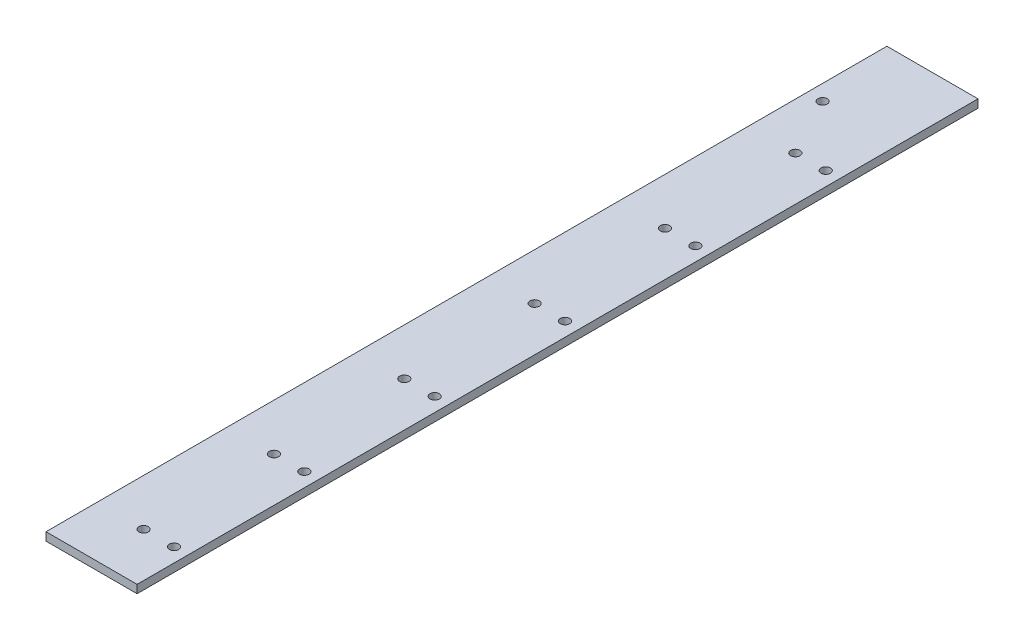
ISO-10303-21;
HEADER;
FILE_DESCRIPTION(('STEP AP214'),'2;1');
FILE_NAME('part.step','',(''),(''),'','','');
FILE_SCHEMA(('AUTOMOTIVE_DESIGN { 1 0 10303 214 1 1 1 1 }'));
ENDSEC;
DATA;
#1=APPLICATION_CONTEXT('core data for automotive mechanical design processes');
#2=APPLICATION_PROTOCOL_DEFINITION('international standard','automotive_design',2000,#1);
#3=PRODUCT_CONTEXT('',#1,'mechanical');
#4=PRODUCT('Part','Part','',(#3));
#5=PRODUCT_RELATED_PRODUCT_CATEGORY('part','',(#4));
#6=PRODUCT_DEFINITION_FORMATION('','',#4);
#7=PRODUCT_DEFINITION_CONTEXT('part definition',#1,'design');
#8=PRODUCT_DEFINITION('design','',#6,#7);
#9=PRODUCT_DEFINITION_SHAPE('','',#8);
#10=(LENGTH_UNIT() NAMED_UNIT(*) SI_UNIT(.MILLI.,.METRE.));
#11=(NAMED_UNIT(*) PLANE_ANGLE_UNIT() SI_UNIT($,.RADIAN.));
#12=(NAMED_UNIT(*) SI_UNIT($,.STERADIAN.) SOLID_ANGLE_UNIT());
#13=UNCERTAINTY_MEASURE_WITH_UNIT(LENGTH_MEASURE(1.E-05),#10,'distance_accuracy_value','');
#14=(GEOMETRIC_REPRESENTATION_CONTEXT(3) GLOBAL_UNCERTAINTY_ASSIGNED_CONTEXT((#13)) GLOBAL_UNIT_ASSIGNED_CONTEXT((#10,
#11,#12)) REPRESENTATION_CONTEXT('',''));
#15=CARTESIAN_POINT('',(0.,0.,0.));
#16=DIRECTION('',(0.,0.,1.));
#17=DIRECTION('',(1.,0.,0.));
#18=AXIS2_PLACEMENT_3D('',#15,#16,#17);
#19=CARTESIAN_POINT('',(13.5,-8.25,338.2));
#20=DIRECTION('',(0.,1.,0.));
#21=DIRECTION('',(0.,0.,1.));
#22=AXIS2_PLACEMENT_3D('',#19,#20,#21);
#23=CYLINDRICAL_SURFACE('',#22,2.);
#24=CARTESIAN_POINT('',(13.5,1.75,338.2));
#25=DIRECTION('',(0.,1.,0.));
#26=DIRECTION('',(0.,0.,1.));
#27=AXIS2_PLACEMENT_3D('',#24,#25,#26);
#28=CIRCLE('',#27,2.);
#29=CARTESIAN_POINT('',(13.5,1.75,340.2));
#30=VERTEX_POINT('',#29);
#31=EDGE_CURVE('E47',#30,#30,#28,.T.);
#32=ORIENTED_EDGE('',*,*,#31,.T.);
#33=EDGE_LOOP('',(#32));
#34=FACE_BOUND('',#33,.T.);
#35=CARTESIAN_POINT('',(13.5,-1.75,338.2));
#36=DIRECTION('',(0.,1.,0.));
#37=DIRECTION('',(0.,0.,1.));
#38=AXIS2_PLACEMENT_3D('',#35,#36,#37);
#39=CIRCLE('',#38,2.);
#40=CARTESIAN_POINT('',(13.5,-1.75,340.2));
#41=VERTEX_POINT('',#40);
#42=EDGE_CURVE('E11',#41,#41,#39,.T.);
#43=ORIENTED_EDGE('',*,*,#42,.F.);
#44=EDGE_LOOP('',(#43));
#45=FACE_BOUND('',#44,.T.);
#46=ADVANCED_FACE('F39',(#34,#45),#23,.F.);
#47=CARTESIAN_POINT('',(13.5,-8.25,282.4));
#48=DIRECTION('',(0.,1.,0.));
#49=DIRECTION('',(0.,0.,1.));
#50=AXIS2_PLACEMENT_3D('',#47,#48,#49);
#51=CYLINDRICAL_SURFACE('',#50,2.);
#52=CARTESIAN_POINT('',(13.5,1.75,282.4));
#53=DIRECTION('',(0.,1.,0.));
#54=DIRECTION('',(0.,0.,1.));
#55=AXIS2_PLACEMENT_3D('',#52,#53,#54);
#56=CIRCLE('',#55,2.);
#57=CARTESIAN_POINT('',(13.5,1.75,284.4));
#58=VERTEX_POINT('',#57);
#59=EDGE_CURVE('E156',#58,#58,#56,.T.);
#60=ORIENTED_EDGE('',*,*,#59,.T.);
#61=EDGE_LOOP('',(#60));
#62=FACE_BOUND('',#61,.T.);
#63=CARTESIAN_POINT('',(13.5,-1.75,282.4));
#64=DIRECTION('',(0.,1.,0.));
#65=DIRECTION('',(0.,0.,1.));
#66=AXIS2_PLACEMENT_3D('',#63,#64,#65);
#67=CIRCLE('',#66,2.);
#68=CARTESIAN_POINT('',(13.5,-1.75,284.4));
#69=VERTEX_POINT('',#68);
#70=EDGE_CURVE('E159',#69,#69,#67,.T.);
#71=ORIENTED_EDGE('',*,*,#70,.F.);
#72=EDGE_LOOP('',(#71));
#73=FACE_BOUND('',#72,.T.);
#74=ADVANCED_FACE('F181',(#62,#73),#51,.F.);
#75=CARTESIAN_POINT('',(13.5,-8.25,226.6));
#76=DIRECTION('',(0.,1.,0.));
#77=DIRECTION('',(0.,0.,1.));
#78=AXIS2_PLACEMENT_3D('',#75,#76,#77);
#79=CYLINDRICAL_SURFACE('',#78,2.);
#80=CARTESIAN_POINT('',(13.5,1.75,226.6));
#81=DIRECTION('',(0.,1.,0.));
#82=DIRECTION('',(0.,0.,1.));
#83=AXIS2_PLACEMENT_3D('',#80,#81,#82);
#84=CIRCLE('',#83,2.);
#85=CARTESIAN_POINT('',(13.5,1.75,228.6));
#86=VERTEX_POINT('',#85);
#87=EDGE_CURVE('E150',#86,#86,#84,.T.);
#88=ORIENTED_EDGE('',*,*,#87,.T.);
#89=EDGE_LOOP('',(#88));
#90=FACE_BOUND('',#89,.T.);
#91=CARTESIAN_POINT('',(13.5,-1.75,226.6));
#92=DIRECTION('',(0.,1.,0.));
#93=DIRECTION('',(0.,0.,1.));
#94=AXIS2_PLACEMENT_3D('',#91,#92,#93);
#95=CIRCLE('',#94,2.);
#96=CARTESIAN_POINT('',(13.5,-1.75,228.6));
#97=VERTEX_POINT('',#96);
#98=EDGE_CURVE('E153',#97,#97,#95,.T.);
#99=ORIENTED_EDGE('',*,*,#98,.F.);
#100=EDGE_LOOP('',(#99));
#101=FACE_BOUND('',#100,.T.);
#102=ADVANCED_FACE('F185',(#90,#101),#79,.F.);
#103=CARTESIAN_POINT('',(13.5,-8.25,170.8));
#104=DIRECTION('',(0.,1.,0.));
#105=DIRECTION('',(0.,0.,1.));
#106=AXIS2_PLACEMENT_3D('',#103,#104,#105);
#107=CYLINDRICAL_SURFACE('',#106,2.);
#108=CARTESIAN_POINT('',(13.5,1.75,170.8));
#109=DIRECTION('',(0.,1.,0.));
#110=DIRECTION('',(0.,0.,1.));
#111=AXIS2_PLACEMENT_3D('',#108,#109,#110);
#112=CIRCLE('',#111,2.);
#113=CARTESIAN_POINT('',(13.5,1.75,172.8));
#114=VERTEX_POINT('',#113);
#115=EDGE_CURVE('E144',#114,#114,#112,.T.);
#116=ORIENTED_EDGE('',*,*,#115,.T.);
#117=EDGE_LOOP('',(#116));
#118=FACE_BOUND('',#117,.T.);
#119=CARTESIAN_POINT('',(13.5,-1.75,170.8));
#120=DIRECTION('',(0.,1.,0.));
#121=DIRECTION('',(0.,0.,1.));
#122=AXIS2_PLACEMENT_3D('',#119,#120,#121);
#123=CIRCLE('',#122,2.);
#124=CARTESIAN_POINT('',(13.5,-1.75,172.8));
#125=VERTEX_POINT('',#124);
#126=EDGE_CURVE('E147',#125,#125,#123,.T.);
#127=ORIENTED_EDGE('',*,*,#126,.F.);
#128=EDGE_LOOP('',(#127));
#129=FACE_BOUND('',#128,.T.);
#130=ADVANCED_FACE('F190',(#118,#129),#107,.F.);
#131=CARTESIAN_POINT('',(0.499999999999994,-8.25,338.2));
#132=DIRECTION('',(0.,1.,0.));
#133=DIRECTION('',(0.,0.,1.));
#134=AXIS2_PLACEMENT_3D('',#131,#132,#133);
#135=CYLINDRICAL_SURFACE('',#134,2.);
#136=CARTESIAN_POINT('',(0.499999999999994,1.75,338.2));
#137=DIRECTION('',(0.,1.,0.));
#138=DIRECTION('',(0.,0.,1.));
#139=AXIS2_PLACEMENT_3D('',#136,#137,#138);
#140=CIRCLE('',#139,2.);
#141=CARTESIAN_POINT('',(0.499999999999994,1.75,340.2));
#142=VERTEX_POINT('',#141);
#143=EDGE_CURVE('E138',#142,#142,#140,.T.);
#144=ORIENTED_EDGE('',*,*,#143,.T.);
#145=EDGE_LOOP('',(#144));
#146=FACE_BOUND('',#145,.T.);
#147=CARTESIAN_POINT('',(0.499999999999994,-1.75,338.2));
#148=DIRECTION('',(0.,1.,0.));
#149=DIRECTION('',(0.,0.,1.));
#150=AXIS2_PLACEMENT_3D('',#147,#148,#149);
#151=CIRCLE('',#150,2.);
#152=CARTESIAN_POINT('',(0.499999999999994,-1.75,340.2));
#153=VERTEX_POINT('',#152);
#154=EDGE_CURVE('E141',#153,#153,#151,.T.);
#155=ORIENTED_EDGE('',*,*,#154,.F.);
#156=EDGE_LOOP('',(#155));
#157=FACE_BOUND('',#156,.T.);
#158=ADVANCED_FACE('F197',(#146,#157),#135,.F.);
#159=CARTESIAN_POINT('',(0.499999999999994,-8.25,282.4));
#160=DIRECTION('',(0.,1.,0.));
#161=DIRECTION('',(0.,0.,1.));
#162=AXIS2_PLACEMENT_3D('',#159,#160,#161);
#163=CYLINDRICAL_SURFACE('',#162,2.);
#164=CARTESIAN_POINT('',(0.499999999999994,1.75,282.4));
#165=DIRECTION('',(0.,1.,0.));
#166=DIRECTION('',(0.,0.,1.));
#167=AXIS2_PLACEMENT_3D('',#164,#165,#166);
#168=CIRCLE('',#167,2.);
#169=CARTESIAN_POINT('',(0.499999999999994,1.75,284.4));
#170=VERTEX_POINT('',#169);
#171=EDGE_CURVE('E132',#170,#170,#168,.T.);
#172=ORIENTED_EDGE('',*,*,#171,.T.);
#173=EDGE_LOOP('',(#172));
#174=FACE_BOUND('',#173,.T.);
#175=CARTESIAN_POINT('',(0.499999999999994,-1.75,282.4));
#176=DIRECTION('',(0.,1.,0.));
#177=DIRECTION('',(0.,0.,1.));
#178=AXIS2_PLACEMENT_3D('',#175,#176,#177);
#179=CIRCLE('',#178,2.);
#180=CARTESIAN_POINT('',(0.499999999999994,-1.75,284.4));
#181=VERTEX_POINT('',#180);
#182=EDGE_CURVE('E135',#181,#181,#179,.T.);
#183=ORIENTED_EDGE('',*,*,#182,.F.);
#184=EDGE_LOOP('',(#183));
#185=FACE_BOUND('',#184,.T.);
#186=ADVANCED_FACE('F201',(#174,#185),#163,.F.);
#187=CARTESIAN_POINT('',(0.499999999999994,-8.25,226.6));
#188=DIRECTION('',(0.,1.,0.));
#189=DIRECTION('',(0.,0.,1.));
#190=AXIS2_PLACEMENT_3D('',#187,#188,#189);
#191=CYLINDRICAL_SURFACE('',#190,2.);
#192=CARTESIAN_POINT('',(0.499999999999994,1.75,226.6));
#193=DIRECTION('',(0.,1.,0.));
#194=DIRECTION('',(0.,0.,1.));
#195=AXIS2_PLACEMENT_3D('',#192,#193,#194);
#196=CIRCLE('',#195,2.);
#197=CARTESIAN_POINT('',(0.499999999999994,1.75,228.6));
#198=VERTEX_POINT('',#197);
#199=EDGE_CURVE('E126',#198,#198,#196,.T.);
#200=ORIENTED_EDGE('',*,*,#199,.T.);
#201=EDGE_LOOP('',(#200));
#202=FACE_BOUND('',#201,.T.);
#203=CARTESIAN_POINT('',(0.499999999999994,-1.75,226.6));
#204=DIRECTION('',(0.,1.,0.));
#205=DIRECTION('',(0.,0.,1.));
#206=AXIS2_PLACEMENT_3D('',#203,#204,#205);
#207=CIRCLE('',#206,2.);
#208=CARTESIAN_POINT('',(0.499999999999994,-1.75,228.6));
#209=VERTEX_POINT('',#208);
#210=EDGE_CURVE('E129',#209,#209,#207,.T.);
#211=ORIENTED_EDGE('',*,*,#210,.F.);
#212=EDGE_LOOP('',(#211));
#213=FACE_BOUND('',#212,.T.);
#214=ADVANCED_FACE('F205',(#202,#213),#191,.F.);
#215=CARTESIAN_POINT('',(0.499999999999994,-8.25,170.8));
#216=DIRECTION('',(0.,1.,0.));
#217=DIRECTION('',(0.,0.,1.));
#218=AXIS2_PLACEMENT_3D('',#215,#216,#217);
#219=CYLINDRICAL_SURFACE('',#218,2.);
#220=CARTESIAN_POINT('',(0.499999999999994,1.75,170.8));
#221=DIRECTION('',(0.,1.,0.));
#222=DIRECTION('',(0.,0.,1.));
#223=AXIS2_PLACEMENT_3D('',#220,#221,#222);
#224=CIRCLE('',#223,2.);
#225=CARTESIAN_POINT('',(0.499999999999994,1.75,172.8));
#226=VERTEX_POINT('',#225);
#227=EDGE_CURVE('E118',#226,#226,#224,.T.);
#228=ORIENTED_EDGE('',*,*,#227,.T.);
#229=EDGE_LOOP('',(#228));
#230=FACE_BOUND('',#229,.T.);
#231=CARTESIAN_POINT('',(0.499999999999994,-1.75,170.8));
#232=DIRECTION('',(0.,1.,0.));
#233=DIRECTION('',(0.,0.,1.));
#234=AXIS2_PLACEMENT_3D('',#231,#232,#233);
#235=CIRCLE('',#234,2.);
#236=CARTESIAN_POINT('',(0.499999999999994,-1.75,172.8));
#237=VERTEX_POINT('',#236);
#238=EDGE_CURVE('E123',#237,#237,#235,.T.);
#239=ORIENTED_EDGE('',*,*,#238,.F.);
#240=EDGE_LOOP('',(#239));
#241=FACE_BOUND('',#240,.T.);
#242=ADVANCED_FACE('F209',(#230,#241),#219,.F.);
#243=CARTESIAN_POINT('',(-19.5,-1.75,360.));
#244=DIRECTION('',(-1.,0.,0.));
#245=DIRECTION('',(0.,0.,1.));
#246=AXIS2_PLACEMENT_3D('',#243,#244,#245);
#247=PLANE('',#246);
#248=DIRECTION('',(0.,1.,0.));
#249=VECTOR('',#248,1.);
#250=CARTESIAN_POINT('',(-19.5,-1.75,0.));
#251=LINE('',#250,#249);
#252=CARTESIAN_POINT('',(-19.5,-1.75,0.));
#253=VERTEX_POINT('',#252);
#254=CARTESIAN_POINT('',(-19.5,1.75,0.));
#255=VERTEX_POINT('',#254);
#256=EDGE_CURVE('E109',#253,#255,#251,.T.);
#257=ORIENTED_EDGE('',*,*,#256,.F.);
#258=DIRECTION('',(0.,0.,-1.));
#259=VECTOR('',#258,1.);
#260=CARTESIAN_POINT('',(-19.5,-1.75,360.));
#261=LINE('',#260,#259);
#262=CARTESIAN_POINT('',(-19.5,-1.75,360.));
#263=VERTEX_POINT('',#262);
#264=EDGE_CURVE('E55',#263,#253,#261,.T.);
#265=ORIENTED_EDGE('',*,*,#264,.F.);
#266=DIRECTION('',(0.,1.,0.));
#267=VECTOR('',#266,1.);
#268=CARTESIAN_POINT('',(-19.5,-1.75,360.));
#269=LINE('',#268,#267);
#270=CARTESIAN_POINT('',(-19.5,1.75,360.));
#271=VERTEX_POINT('',#270);
#272=EDGE_CURVE('E103',#263,#271,#269,.T.);
#273=ORIENTED_EDGE('',*,*,#272,.T.);
#274=DIRECTION('',(0.,0.,-1.));
#275=VECTOR('',#274,1.);
#276=CARTESIAN_POINT('',(-19.5,1.75,360.));
#277=LINE('',#276,#275);
#278=EDGE_CURVE('E80',#271,#255,#277,.T.);
#279=ORIENTED_EDGE('',*,*,#278,.T.);
#280=EDGE_LOOP('',(#257,#265,#273,#279));
#281=FACE_BOUND('',#280,.T.);
#282=ADVANCED_FACE('F212',(#281),#247,.T.);
#283=CARTESIAN_POINT('',(-19.5,-1.75,360.));
#284=DIRECTION('',(0.,1.,0.));
#285=DIRECTION('',(0.,0.,1.));
#286=AXIS2_PLACEMENT_3D('',#283,#284,#285);
#287=PLANE('',#286);
#288=CARTESIAN_POINT('',(13.5,-1.75,115.));
#289=DIRECTION('',(0.,1.,0.));
#290=DIRECTION('',(0.,0.,1.));
#291=AXIS2_PLACEMENT_3D('',#288,#289,#290);
#292=CIRCLE('',#291,2.);
#293=CARTESIAN_POINT('',(13.5,-1.75,117.));
#294=VERTEX_POINT('',#293);
#295=EDGE_CURVE('E252',#294,#294,#292,.T.);
#296=ORIENTED_EDGE('',*,*,#295,.T.);
#297=EDGE_LOOP('',(#296));
#298=FACE_BOUND('',#297,.T.);
#299=CARTESIAN_POINT('',(0.499999999999994,-1.75,115.));
#300=DIRECTION('',(0.,1.,0.));
#301=DIRECTION('',(0.,0.,1.));
#302=AXIS2_PLACEMENT_3D('',#299,#300,#301);
#303=CIRCLE('',#302,2.);
#304=CARTESIAN_POINT('',(0.499999999999994,-1.75,117.));
#305=VERTEX_POINT('',#304);
#306=EDGE_CURVE('E256',#305,#305,#303,.T.);
#307=ORIENTED_EDGE('',*,*,#306,.T.);
#308=EDGE_LOOP('',(#307));
#309=FACE_BOUND('',#308,.T.);
#310=CARTESIAN_POINT('',(0.499999999999994,-1.75,59.2));
#311=DIRECTION('',(0.,1.,0.));
#312=DIRECTION('',(0.,0.,1.));
#313=AXIS2_PLACEMENT_3D('',#310,#311,#312);
#314=CIRCLE('',#313,2.);
#315=CARTESIAN_POINT('',(0.499999999999994,-1.75,61.2));
#316=VERTEX_POINT('',#315);
#317=EDGE_CURVE('E271',#316,#316,#314,.T.);
#318=ORIENTED_EDGE('',*,*,#317,.T.);
#319=EDGE_LOOP('',(#318));
#320=FACE_BOUND('',#319,.T.);
#321=CARTESIAN_POINT('',(13.5,-1.75,59.2));
#322=DIRECTION('',(0.,1.,0.));
#323=DIRECTION('',(0.,0.,1.));
#324=AXIS2_PLACEMENT_3D('',#321,#322,#323);
#325=CIRCLE('',#324,2.);
#326=CARTESIAN_POINT('',(13.5,-1.75,61.2));
#327=VERTEX_POINT('',#326);
#328=EDGE_CURVE('E266',#327,#327,#325,.T.);
#329=ORIENTED_EDGE('',*,*,#328,.T.);
#330=EDGE_LOOP('',(#329));
#331=FACE_BOUND('',#330,.T.);
#332=CARTESIAN_POINT('',(-12.8206550376605,-1.75,34.2248903943909));
#333=DIRECTION('',(0.,1.,0.));
#334=DIRECTION('',(0.,0.,1.));
#335=AXIS2_PLACEMENT_3D('',#332,#333,#334);
#336=CIRCLE('',#335,2.);
#337=CARTESIAN_POINT('',(-12.8206550376605,-1.75,36.2248903943909));
#338=VERTEX_POINT('',#337);
#339=EDGE_CURVE('E113',#338,#338,#336,.T.);
#340=ORIENTED_EDGE('',*,*,#339,.T.);
#341=EDGE_LOOP('',(#340));
#342=FACE_BOUND('',#341,.T.);
#343=DIRECTION('',(1.,0.,0.));
#344=VECTOR('',#343,1.);
#345=CARTESIAN_POINT('',(-19.5,-1.75,0.));
#346=LINE('',#345,#344);
#347=CARTESIAN_POINT('',(19.5,-1.75,0.));
#348=VERTEX_POINT('',#347);
#349=EDGE_CURVE('E72',#253,#348,#346,.T.);
#350=ORIENTED_EDGE('',*,*,#349,.T.);
#351=DIRECTION('',(0.,0.,-1.));
#352=VECTOR('',#351,1.);
#353=CARTESIAN_POINT('',(19.5,-1.75,360.));
#354=LINE('',#353,#352);
#355=CARTESIAN_POINT('',(19.5,-1.75,360.));
#356=VERTEX_POINT('',#355);
#357=EDGE_CURVE('E99',#356,#348,#354,.T.);
#358=ORIENTED_EDGE('',*,*,#357,.F.);
#359=DIRECTION('',(1.,0.,0.));
#360=VECTOR('',#359,1.);
#361=CARTESIAN_POINT('',(-19.5,-1.75,360.));
#362=LINE('',#361,#360);
#363=EDGE_CURVE('E90',#263,#356,#362,.T.);
#364=ORIENTED_EDGE('',*,*,#363,.F.);
#365=ORIENTED_EDGE('',*,*,#264,.T.);
#366=EDGE_LOOP('',(#350,#358,#364,#365));
#367=FACE_BOUND('',#366,.T.);
#368=ORIENTED_EDGE('',*,*,#238,.T.);
#369=EDGE_LOOP('',(#368));
#370=FACE_BOUND('',#369,.T.);
#371=ORIENTED_EDGE('',*,*,#210,.T.);
#372=EDGE_LOOP('',(#371));
#373=FACE_BOUND('',#372,.T.);
#374=ORIENTED_EDGE('',*,*,#182,.T.);
#375=EDGE_LOOP('',(#374));
#376=FACE_BOUND('',#375,.T.);
#377=ORIENTED_EDGE('',*,*,#154,.T.);
#378=EDGE_LOOP('',(#377));
#379=FACE_BOUND('',#378,.T.);
#380=ORIENTED_EDGE('',*,*,#126,.T.);
#381=EDGE_LOOP('',(#380));
#382=FACE_BOUND('',#381,.T.);
#383=ORIENTED_EDGE('',*,*,#98,.T.);
#384=EDGE_LOOP('',(#383));
#385=FACE_BOUND('',#384,.T.);
#386=ORIENTED_EDGE('',*,*,#70,.T.);
#387=EDGE_LOOP('',(#386));
#388=FACE_BOUND('',#387,.T.);
#389=ORIENTED_EDGE('',*,*,#42,.T.);
#390=EDGE_LOOP('',(#389));
#391=FACE_BOUND('',#390,.T.);
#392=ADVANCED_FACE('F175',(#298,#309,#320,#331,#342,#367,#370,#373,#376,#379,#382,#385,#388,
#391),#287,.F.);
#393=CARTESIAN_POINT('',(19.5,-1.75,360.));
#394=DIRECTION('',(-1.,0.,0.));
#395=DIRECTION('',(0.,0.,1.));
#396=AXIS2_PLACEMENT_3D('',#393,#394,#395);
#397=PLANE('',#396);
#398=DIRECTION('',(0.,1.,0.));
#399=VECTOR('',#398,1.);
#400=CARTESIAN_POINT('',(19.5,-1.75,0.));
#401=LINE('',#400,#399);
#402=CARTESIAN_POINT('',(19.5,1.75,0.));
#403=VERTEX_POINT('',#402);
#404=EDGE_CURVE('E97',#348,#403,#401,.T.);
#405=ORIENTED_EDGE('',*,*,#404,.T.);
#406=DIRECTION('',(0.,0.,-1.));
#407=VECTOR('',#406,1.);
#408=CARTESIAN_POINT('',(19.5,1.75,360.));
#409=LINE('',#408,#407);
#410=CARTESIAN_POINT('',(19.5,1.75,360.));
#411=VERTEX_POINT('',#410);
#412=EDGE_CURVE('E94',#411,#403,#409,.T.);
#413=ORIENTED_EDGE('',*,*,#412,.F.);
#414=DIRECTION('',(0.,1.,0.));
#415=VECTOR('',#414,1.);
#416=CARTESIAN_POINT('',(19.5,-1.75,360.));
#417=LINE('',#416,#415);
#418=EDGE_CURVE('E85',#356,#411,#417,.T.);
#419=ORIENTED_EDGE('',*,*,#418,.F.);
#420=ORIENTED_EDGE('',*,*,#357,.T.);
#421=EDGE_LOOP('',(#405,#413,#419,#420));
#422=FACE_BOUND('',#421,.T.);
#423=ADVANCED_FACE('F95',(#422),#397,.F.);
#424=CARTESIAN_POINT('',(-19.5,1.75,360.));
#425=DIRECTION('',(0.,1.,0.));
#426=DIRECTION('',(0.,0.,1.));
#427=AXIS2_PLACEMENT_3D('',#424,#425,#426);
#428=PLANE('',#427);
#429=CARTESIAN_POINT('',(13.5,1.75,115.));
#430=DIRECTION('',(0.,1.,0.));
#431=DIRECTION('',(0.,0.,1.));
#432=AXIS2_PLACEMENT_3D('',#429,#430,#431);
#433=CIRCLE('',#432,2.);
#434=CARTESIAN_POINT('',(13.5,1.75,117.));
#435=VERTEX_POINT('',#434);
#436=EDGE_CURVE('E249',#435,#435,#433,.T.);
#437=ORIENTED_EDGE('',*,*,#436,.F.);
#438=EDGE_LOOP('',(#437));
#439=FACE_BOUND('',#438,.T.);
#440=CARTESIAN_POINT('',(0.499999999999994,1.75,115.));
#441=DIRECTION('',(0.,1.,0.));
#442=DIRECTION('',(0.,0.,1.));
#443=AXIS2_PLACEMENT_3D('',#440,#441,#442);
#444=CIRCLE('',#443,2.);
#445=CARTESIAN_POINT('',(0.499999999999994,1.75,117.));
#446=VERTEX_POINT('',#445);
#447=EDGE_CURVE('E253',#446,#446,#444,.T.);
#448=ORIENTED_EDGE('',*,*,#447,.F.);
#449=EDGE_LOOP('',(#448));
#450=FACE_BOUND('',#449,.T.);
#451=CARTESIAN_POINT('',(0.499999999999994,1.75,59.2));
#452=DIRECTION('',(0.,1.,0.));
#453=DIRECTION('',(0.,0.,1.));
#454=AXIS2_PLACEMENT_3D('',#451,#452,#453);
#455=CIRCLE('',#454,2.);
#456=CARTESIAN_POINT('',(0.499999999999994,1.75,61.2));
#457=VERTEX_POINT('',#456);
#458=EDGE_CURVE('E263',#457,#457,#455,.T.);
#459=ORIENTED_EDGE('',*,*,#458,.F.);
#460=EDGE_LOOP('',(#459));
#461=FACE_BOUND('',#460,.T.);
#462=CARTESIAN_POINT('',(13.5,1.75,59.2));
#463=DIRECTION('',(0.,1.,0.));
#464=DIRECTION('',(0.,0.,1.));
#465=AXIS2_PLACEMENT_3D('',#462,#463,#464);
#466=CIRCLE('',#465,2.);
#467=CARTESIAN_POINT('',(13.5,1.75,61.2));
#468=VERTEX_POINT('',#467);
#469=EDGE_CURVE('E262',#468,#468,#466,.T.);
#470=ORIENTED_EDGE('',*,*,#469,.F.);
#471=EDGE_LOOP('',(#470));
#472=FACE_BOUND('',#471,.T.);
#473=CARTESIAN_POINT('',(-12.8206550376605,1.75,34.2248903943909));
#474=DIRECTION('',(0.,1.,0.));
#475=DIRECTION('',(0.,0.,1.));
#476=AXIS2_PLACEMENT_3D('',#473,#474,#475);
#477=CIRCLE('',#476,2.);
#478=CARTESIAN_POINT('',(-12.8206550376605,1.75,36.2248903943909));
#479=VERTEX_POINT('',#478);
#480=EDGE_CURVE('E274',#479,#479,#477,.T.);
#481=ORIENTED_EDGE('',*,*,#480,.F.);
#482=EDGE_LOOP('',(#481));
#483=FACE_BOUND('',#482,.T.);
#484=DIRECTION('',(1.,0.,0.));
#485=VECTOR('',#484,1.);
#486=CARTESIAN_POINT('',(-19.5,1.75,0.));
#487=LINE('',#486,#485);
#488=EDGE_CURVE('E112',#255,#403,#487,.T.);
#489=ORIENTED_EDGE('',*,*,#488,.F.);
#490=ORIENTED_EDGE('',*,*,#278,.F.);
#491=DIRECTION('',(1.,0.,0.));
#492=VECTOR('',#491,1.);
#493=CARTESIAN_POINT('',(-19.5,1.75,360.));
#494=LINE('',#493,#492);
#495=EDGE_CURVE('E89',#271,#411,#494,.T.);
#496=ORIENTED_EDGE('',*,*,#495,.T.);
#497=ORIENTED_EDGE('',*,*,#412,.T.);
#498=EDGE_LOOP('',(#489,#490,#496,#497));
#499=FACE_BOUND('',#498,.T.);
#500=ORIENTED_EDGE('',*,*,#227,.F.);
#501=EDGE_LOOP('',(#500));
#502=FACE_BOUND('',#501,.T.);
#503=ORIENTED_EDGE('',*,*,#199,.F.);
#504=EDGE_LOOP('',(#503));
#505=FACE_BOUND('',#504,.T.);
#506=ORIENTED_EDGE('',*,*,#171,.F.);
#507=EDGE_LOOP('',(#506));
#508=FACE_BOUND('',#507,.T.);
#509=ORIENTED_EDGE('',*,*,#143,.F.);
#510=EDGE_LOOP('',(#509));
#511=FACE_BOUND('',#510,.T.);
#512=ORIENTED_EDGE('',*,*,#115,.F.);
#513=EDGE_LOOP('',(#512));
#514=FACE_BOUND('',#513,.T.);
#515=ORIENTED_EDGE('',*,*,#87,.F.);
#516=EDGE_LOOP('',(#515));
#517=FACE_BOUND('',#516,.T.);
#518=ORIENTED_EDGE('',*,*,#59,.F.);
#519=EDGE_LOOP('',(#518));
#520=FACE_BOUND('',#519,.T.);
#521=ORIENTED_EDGE('',*,*,#31,.F.);
#522=EDGE_LOOP('',(#521));
#523=FACE_BOUND('',#522,.T.);
#524=ADVANCED_FACE('F101',(#439,#450,#461,#472,#483,#499,#502,#505,#508,#511,#514,#517,#520,
#523),#428,.T.);
#525=CARTESIAN_POINT('',(0.,0.,360.));
#526=DIRECTION('',(0.,0.,-1.));
#527=DIRECTION('',(-1.,0.,0.));
#528=AXIS2_PLACEMENT_3D('',#525,#526,#527);
#529=PLANE('',#528);
#530=ORIENTED_EDGE('',*,*,#272,.F.);
#531=ORIENTED_EDGE('',*,*,#363,.T.);
#532=ORIENTED_EDGE('',*,*,#418,.T.);
#533=ORIENTED_EDGE('',*,*,#495,.F.);
#534=EDGE_LOOP('',(#530,#531,#532,#533));
#535=FACE_BOUND('',#534,.T.);
#536=ADVANCED_FACE('F88',(#535),#529,.F.);
#537=CARTESIAN_POINT('',(0.,0.,0.));
#538=DIRECTION('',(0.,0.,-1.));
#539=DIRECTION('',(-1.,0.,0.));
#540=AXIS2_PLACEMENT_3D('',#537,#538,#539);
#541=PLANE('',#540);
#542=ORIENTED_EDGE('',*,*,#256,.T.);
#543=ORIENTED_EDGE('',*,*,#488,.T.);
#544=ORIENTED_EDGE('',*,*,#404,.F.);
#545=ORIENTED_EDGE('',*,*,#349,.F.);
#546=EDGE_LOOP('',(#542,#543,#544,#545));
#547=FACE_BOUND('',#546,.T.);
#548=ADVANCED_FACE('F173',(#547),#541,.T.);
#549=CARTESIAN_POINT('',(-12.8206550376605,-8.25,34.2248903943909));
#550=DIRECTION('',(0.,1.,0.));
#551=DIRECTION('',(0.,0.,1.));
#552=AXIS2_PLACEMENT_3D('',#549,#550,#551);
#553=CYLINDRICAL_SURFACE('',#552,2.);
#554=ORIENTED_EDGE('',*,*,#480,.T.);
#555=EDGE_LOOP('',(#554));
#556=FACE_BOUND('',#555,.T.);
#557=ORIENTED_EDGE('',*,*,#339,.F.);
#558=EDGE_LOOP('',(#557));
#559=FACE_BOUND('',#558,.T.);
#560=ADVANCED_FACE('F222',(#556,#559),#553,.F.);
#561=CARTESIAN_POINT('',(13.5,-8.25,59.2));
#562=DIRECTION('',(0.,1.,0.));
#563=DIRECTION('',(0.,0.,1.));
#564=AXIS2_PLACEMENT_3D('',#561,#562,#563);
#565=CYLINDRICAL_SURFACE('',#564,2.);
#566=ORIENTED_EDGE('',*,*,#469,.T.);
#567=EDGE_LOOP('',(#566));
#568=FACE_BOUND('',#567,.T.);
#569=ORIENTED_EDGE('',*,*,#328,.F.);
#570=EDGE_LOOP('',(#569));
#571=FACE_BOUND('',#570,.T.);
#572=ADVANCED_FACE('F227',(#568,#571),#565,.F.);
#573=CARTESIAN_POINT('',(0.499999999999994,-8.25,59.2));
#574=DIRECTION('',(0.,1.,0.));
#575=DIRECTION('',(0.,0.,1.));
#576=AXIS2_PLACEMENT_3D('',#573,#574,#575);
#577=CYLINDRICAL_SURFACE('',#576,2.);
#578=ORIENTED_EDGE('',*,*,#458,.T.);
#579=EDGE_LOOP('',(#578));
#580=FACE_BOUND('',#579,.T.);
#581=ORIENTED_EDGE('',*,*,#317,.F.);
#582=EDGE_LOOP('',(#581));
#583=FACE_BOUND('',#582,.T.);
#584=ADVANCED_FACE('F233',(#580,#583),#577,.F.);
#585=CARTESIAN_POINT('',(0.499999999999994,-8.25,115.));
#586=DIRECTION('',(0.,1.,0.));
#587=DIRECTION('',(0.,0.,1.));
#588=AXIS2_PLACEMENT_3D('',#585,#586,#587);
#589=CYLINDRICAL_SURFACE('',#588,2.);
#590=ORIENTED_EDGE('',*,*,#447,.T.);
#591=EDGE_LOOP('',(#590));
#592=FACE_BOUND('',#591,.T.);
#593=ORIENTED_EDGE('',*,*,#306,.F.);
#594=EDGE_LOOP('',(#593));
#595=FACE_BOUND('',#594,.T.);
#596=ADVANCED_FACE('F237',(#592,#595),#589,.F.);
#597=CARTESIAN_POINT('',(13.5,-8.25,115.));
#598=DIRECTION('',(0.,1.,0.));
#599=DIRECTION('',(0.,0.,1.));
#600=AXIS2_PLACEMENT_3D('',#597,#598,#599);
#601=CYLINDRICAL_SURFACE('',#600,2.);
#602=ORIENTED_EDGE('',*,*,#436,.T.);
#603=EDGE_LOOP('',(#602));
#604=FACE_BOUND('',#603,.T.);
#605=ORIENTED_EDGE('',*,*,#295,.F.);
#606=EDGE_LOOP('',(#605));
#607=FACE_BOUND('',#606,.T.);
#608=ADVANCED_FACE('F241',(#604,#607),#601,.F.);
#609=CLOSED_SHELL('',(#46,#74,#102,#130,#158,#186,#214,#242,#282,#392,#423,#524,#536,#548,#560,
#572,#584,#596,#608));
#610=MANIFOLD_SOLID_BREP('B2',#609);
#611=ADVANCED_BREP_SHAPE_REPRESENTATION('',(#18,#610),#14);
#612=SHAPE_DEFINITION_REPRESENTATION(#9,#611);
ENDSEC;
END-ISO-10303-21;
